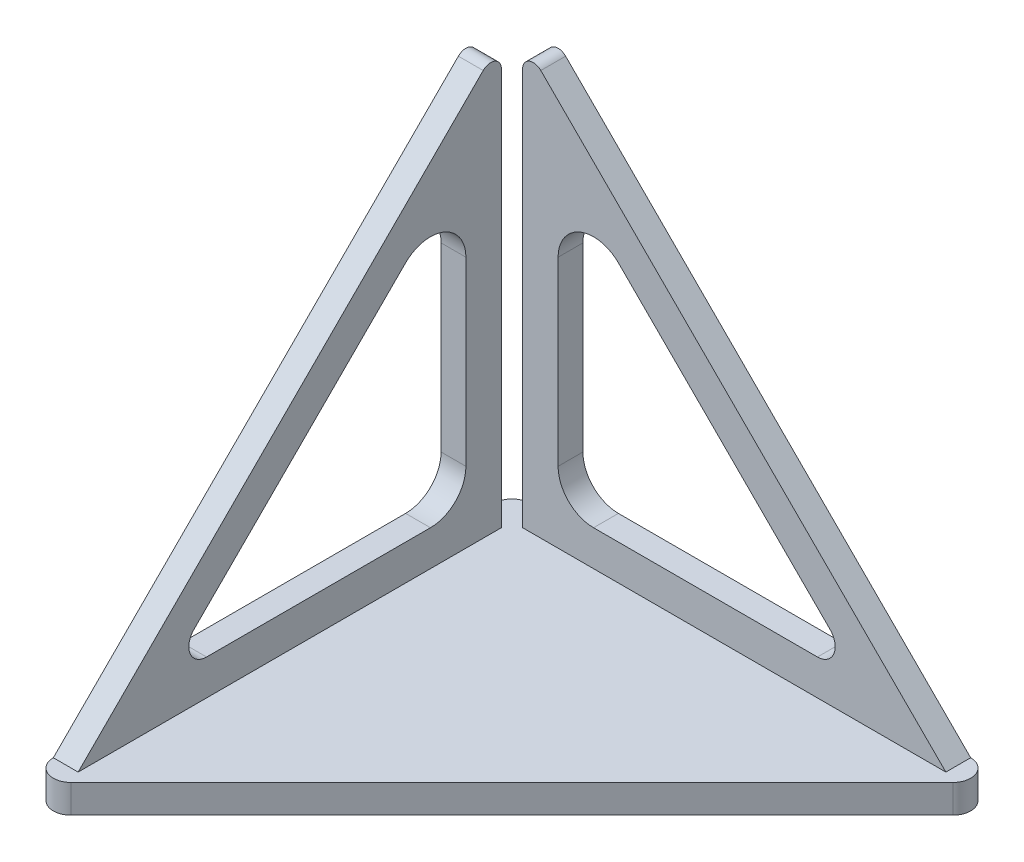
ISO-10303-21;
HEADER;
FILE_DESCRIPTION(('STEP AP214'),'2;1');
FILE_NAME('part.step','',(''),(''),'','','');
FILE_SCHEMA(('AUTOMOTIVE_DESIGN { 1 0 10303 214 1 1 1 1 }'));
ENDSEC;
DATA;
#1=APPLICATION_CONTEXT('core data for automotive mechanical design processes');
#2=APPLICATION_PROTOCOL_DEFINITION('international standard','automotive_design',2000,#1);
#3=PRODUCT_CONTEXT('',#1,'mechanical');
#4=PRODUCT('Part','Part','',(#3));
#5=PRODUCT_RELATED_PRODUCT_CATEGORY('part','',(#4));
#6=PRODUCT_DEFINITION_FORMATION('','',#4);
#7=PRODUCT_DEFINITION_CONTEXT('part definition',#1,'design');
#8=PRODUCT_DEFINITION('design','',#6,#7);
#9=PRODUCT_DEFINITION_SHAPE('','',#8);
#10=(LENGTH_UNIT() NAMED_UNIT(*) SI_UNIT(.MILLI.,.METRE.));
#11=(NAMED_UNIT(*) PLANE_ANGLE_UNIT() SI_UNIT($,.RADIAN.));
#12=(NAMED_UNIT(*) SI_UNIT($,.STERADIAN.) SOLID_ANGLE_UNIT());
#13=UNCERTAINTY_MEASURE_WITH_UNIT(LENGTH_MEASURE(1.E-05),#10,'distance_accuracy_value','');
#14=(GEOMETRIC_REPRESENTATION_CONTEXT(3) GLOBAL_UNCERTAINTY_ASSIGNED_CONTEXT((#13)) GLOBAL_UNIT_ASSIGNED_CONTEXT((#10,
#11,#12)) REPRESENTATION_CONTEXT('',''));
#15=CARTESIAN_POINT('',(0.,0.,0.));
#16=DIRECTION('',(0.,0.,1.));
#17=DIRECTION('',(1.,0.,0.));
#18=AXIS2_PLACEMENT_3D('',#15,#16,#17);
#19=CARTESIAN_POINT('',(5.,0.,5.));
#20=DIRECTION('',(0.,1.,0.));
#21=DIRECTION('',(0.,0.,1.));
#22=AXIS2_PLACEMENT_3D('',#19,#20,#21);
#23=PLANE('',#22);
#24=DIRECTION('',(0.,0.,1.));
#25=VECTOR('',#24,1.);
#26=CARTESIAN_POINT('',(0.,0.,5.00000000000004));
#27=LINE('',#26,#25);
#28=CARTESIAN_POINT('',(0.,0.,5.00000000000004));
#29=VERTEX_POINT('',#28);
#30=CARTESIAN_POINT('',(0.,0.,10.));
#31=VERTEX_POINT('',#30);
#32=EDGE_CURVE('E328',#29,#31,#27,.T.);
#33=ORIENTED_EDGE('',*,*,#32,.T.);
#34=DIRECTION('',(-1.,0.,0.));
#35=VECTOR('',#34,1.);
#36=CARTESIAN_POINT('',(7.,0.,10.));
#37=LINE('',#36,#35);
#38=CARTESIAN_POINT('',(7.,0.,10.));
#39=VERTEX_POINT('',#38);
#40=EDGE_CURVE('E259',#39,#31,#37,.T.);
#41=ORIENTED_EDGE('',*,*,#40,.F.);
#42=DIRECTION('',(0.,0.,-1.));
#43=VECTOR('',#42,1.);
#44=CARTESIAN_POINT('',(7.,0.,129.350288425444));
#45=LINE('',#44,#43);
#46=CARTESIAN_POINT('',(7.,0.,129.350288425444));
#47=VERTEX_POINT('',#46);
#48=EDGE_CURVE('E244',#47,#39,#45,.T.);
#49=ORIENTED_EDGE('',*,*,#48,.F.);
#50=DIRECTION('',(-1.,0.,0.));
#51=VECTOR('',#50,1.);
#52=CARTESIAN_POINT('',(7.,0.,129.350288425444));
#53=LINE('',#52,#51);
#54=CARTESIAN_POINT('',(0.,0.,129.350288425444));
#55=VERTEX_POINT('',#54);
#56=EDGE_CURVE('E252',#47,#55,#53,.T.);
#57=ORIENTED_EDGE('',*,*,#56,.T.);
#58=CARTESIAN_POINT('',(5.,0.,129.350288425444));
#59=DIRECTION('',(0.,1.,0.));
#60=DIRECTION('',(0.,0.,-1.));
#61=AXIS2_PLACEMENT_3D('',#58,#59,#60);
#62=CIRCLE('',#61,4.99999999999999);
#63=CARTESIAN_POINT('',(8.53553390593273,0.,132.885822331377));
#64=VERTEX_POINT('',#63);
#65=EDGE_CURVE('E330',#55,#64,#62,.T.);
#66=ORIENTED_EDGE('',*,*,#65,.T.);
#67=DIRECTION('',(0.707106781186547,0.,-0.707106781186548));
#68=VECTOR('',#67,1.);
#69=CARTESIAN_POINT('',(8.53553390593273,0.,132.885822331377));
#70=LINE('',#69,#68);
#71=CARTESIAN_POINT('',(132.885822331377,0.,8.53553390593272));
#72=VERTEX_POINT('',#71);
#73=EDGE_CURVE('E332',#64,#72,#70,.T.);
#74=ORIENTED_EDGE('',*,*,#73,.T.);
#75=CARTESIAN_POINT('',(129.350288425444,0.,5.));
#76=DIRECTION('',(0.,1.,0.));
#77=DIRECTION('',(0.,0.,1.));
#78=AXIS2_PLACEMENT_3D('',#75,#76,#77);
#79=CIRCLE('',#78,4.99999999999997);
#80=CARTESIAN_POINT('',(129.350288425444,0.,0.));
#81=VERTEX_POINT('',#80);
#82=EDGE_CURVE('E335',#72,#81,#79,.T.);
#83=ORIENTED_EDGE('',*,*,#82,.T.);
#84=DIRECTION('',(0.,0.,-1.));
#85=VECTOR('',#84,1.);
#86=CARTESIAN_POINT('',(129.350288425444,0.,7.));
#87=LINE('',#86,#85);
#88=CARTESIAN_POINT('',(129.350288425444,0.,7.));
#89=VERTEX_POINT('',#88);
#90=EDGE_CURVE('E300',#89,#81,#87,.T.);
#91=ORIENTED_EDGE('',*,*,#90,.F.);
#92=DIRECTION('',(-1.,0.,0.));
#93=VECTOR('',#92,1.);
#94=CARTESIAN_POINT('',(129.350288425444,0.,7.));
#95=LINE('',#94,#93);
#96=CARTESIAN_POINT('',(10.,0.,7.));
#97=VERTEX_POINT('',#96);
#98=EDGE_CURVE('E287',#89,#97,#95,.T.);
#99=ORIENTED_EDGE('',*,*,#98,.T.);
#100=DIRECTION('',(0.,0.,-1.));
#101=VECTOR('',#100,1.);
#102=CARTESIAN_POINT('',(10.,0.,7.));
#103=LINE('',#102,#101);
#104=CARTESIAN_POINT('',(10.,0.,0.));
#105=VERTEX_POINT('',#104);
#106=EDGE_CURVE('E296',#97,#105,#103,.T.);
#107=ORIENTED_EDGE('',*,*,#106,.T.);
#108=DIRECTION('',(-1.,0.,0.));
#109=VECTOR('',#108,1.);
#110=CARTESIAN_POINT('',(129.350288425444,0.,0.));
#111=LINE('',#110,#109);
#112=CARTESIAN_POINT('',(5.00000000000004,0.,0.));
#113=VERTEX_POINT('',#112);
#114=EDGE_CURVE('E310',#105,#113,#111,.T.);
#115=ORIENTED_EDGE('',*,*,#114,.T.);
#116=CARTESIAN_POINT('',(5.,0.,5.));
#117=DIRECTION('',(0.,1.,0.));
#118=DIRECTION('',(0.,0.,1.));
#119=AXIS2_PLACEMENT_3D('',#116,#117,#118);
#120=CIRCLE('',#119,5.);
#121=EDGE_CURVE('E303',#113,#29,#120,.T.);
#122=ORIENTED_EDGE('',*,*,#121,.T.);
#123=EDGE_LOOP('',(#33,#41,#49,#57,#66,#74,#83,#91,#99,#107,#115,#122));
#124=FACE_BOUND('',#123,.T.);
#125=ADVANCED_FACE('F73',(#124),#23,.T.);
#126=CARTESIAN_POINT('',(5.,-8.,5.));
#127=DIRECTION('',(0.,1.,0.));
#128=DIRECTION('',(0.,0.,1.));
#129=AXIS2_PLACEMENT_3D('',#126,#127,#128);
#130=CYLINDRICAL_SURFACE('',#129,5.);
#131=ORIENTED_EDGE('',*,*,#121,.F.);
#132=DIRECTION('',(0.,1.,0.));
#133=VECTOR('',#132,1.);
#134=CARTESIAN_POINT('',(5.00000000000004,-8.,0.));
#135=LINE('',#134,#133);
#136=CARTESIAN_POINT('',(5.00000000000004,-8.,0.));
#137=VERTEX_POINT('',#136);
#138=EDGE_CURVE('E339',#137,#113,#135,.T.);
#139=ORIENTED_EDGE('',*,*,#138,.F.);
#140=CARTESIAN_POINT('',(5.,-8.,5.));
#141=DIRECTION('',(0.,1.,0.));
#142=DIRECTION('',(0.,0.,1.));
#143=AXIS2_PLACEMENT_3D('',#140,#141,#142);
#144=CIRCLE('',#143,5.);
#145=CARTESIAN_POINT('',(0.,-8.,5.00000000000004));
#146=VERTEX_POINT('',#145);
#147=EDGE_CURVE('E306',#137,#146,#144,.T.);
#148=ORIENTED_EDGE('',*,*,#147,.T.);
#149=DIRECTION('',(0.,1.,0.));
#150=VECTOR('',#149,1.);
#151=CARTESIAN_POINT('',(0.,-8.,5.00000000000004));
#152=LINE('',#151,#150);
#153=EDGE_CURVE('E325',#146,#29,#152,.T.);
#154=ORIENTED_EDGE('',*,*,#153,.T.);
#155=EDGE_LOOP('',(#131,#139,#148,#154));
#156=FACE_BOUND('',#155,.T.);
#157=ADVANCED_FACE('F467',(#156),#130,.T.);
#158=CARTESIAN_POINT('',(129.350288425444,-8.,0.));
#159=DIRECTION('',(0.,0.,-1.));
#160=DIRECTION('',(-1.,0.,0.));
#161=AXIS2_PLACEMENT_3D('',#158,#159,#160);
#162=PLANE('',#161);
#163=DIRECTION('',(0.,1.,0.));
#164=VECTOR('',#163,1.);
#165=CARTESIAN_POINT('',(10.,0.,0.));
#166=LINE('',#165,#164);
#167=CARTESIAN_POINT('',(10.,112.107647738324,0.));
#168=VERTEX_POINT('',#167);
#169=EDGE_CURVE('E280',#105,#168,#166,.T.);
#170=ORIENTED_EDGE('',*,*,#169,.T.);
#171=CARTESIAN_POINT('',(13.,112.107647738324,0.));
#172=DIRECTION('',(0.,0.,-1.));
#173=DIRECTION('',(-1.,0.,0.));
#174=AXIS2_PLACEMENT_3D('',#171,#172,#173);
#175=CIRCLE('',#174,3.);
#176=CARTESIAN_POINT('',(15.1213203435597,114.228968081883,0.));
#177=VERTEX_POINT('',#176);
#178=EDGE_CURVE('E412',#168,#177,#175,.T.);
#179=ORIENTED_EDGE('',*,*,#178,.T.);
#180=DIRECTION('',(0.707106781186551,-0.707106781186544,0.));
#181=VECTOR('',#180,1.);
#182=CARTESIAN_POINT('',(10.,119.350288425443,0.));
#183=LINE('',#182,#181);
#184=EDGE_CURVE('E291',#177,#81,#183,.T.);
#185=ORIENTED_EDGE('',*,*,#184,.T.);
#186=DIRECTION('',(0.,1.,0.));
#187=VECTOR('',#186,1.);
#188=CARTESIAN_POINT('',(129.350288425444,-8.,0.));
#189=LINE('',#188,#187);
#190=CARTESIAN_POINT('',(129.350288425444,-8.,0.));
#191=VERTEX_POINT('',#190);
#192=EDGE_CURVE('E343',#191,#81,#189,.T.);
#193=ORIENTED_EDGE('',*,*,#192,.F.);
#194=DIRECTION('',(-1.,0.,0.));
#195=VECTOR('',#194,1.);
#196=CARTESIAN_POINT('',(129.350288425444,-8.,0.));
#197=LINE('',#196,#195);
#198=EDGE_CURVE('E322',#191,#137,#197,.T.);
#199=ORIENTED_EDGE('',*,*,#198,.T.);
#200=ORIENTED_EDGE('',*,*,#138,.T.);
#201=ORIENTED_EDGE('',*,*,#114,.F.);
#202=EDGE_LOOP('',(#170,#179,#185,#193,#199,#200,#201));
#203=FACE_BOUND('',#202,.T.);
#204=DIRECTION('',(-1.,0.,0.));
#205=VECTOR('',#204,1.);
#206=CARTESIAN_POINT('',(129.350288425444,10.,0.));
#207=LINE('',#206,#205);
#208=CARTESIAN_POINT('',(93.1370849898474,10.,0.));
#209=VERTEX_POINT('',#208);
#210=CARTESIAN_POINT('',(30.,10.,0.));
#211=VERTEX_POINT('',#210);
#212=EDGE_CURVE('E258',#209,#211,#207,.T.);
#213=ORIENTED_EDGE('',*,*,#212,.F.);
#214=CARTESIAN_POINT('',(93.1370849898474,15.,0.));
#215=DIRECTION('',(0.,0.,-1.));
#216=DIRECTION('',(-1.,0.,0.));
#217=AXIS2_PLACEMENT_3D('',#214,#215,#216);
#218=CIRCLE('',#217,5.);
#219=CARTESIAN_POINT('',(96.6726188957801,18.5355339059327,0.));
#220=VERTEX_POINT('',#219);
#221=EDGE_CURVE('E405',#209,#220,#218,.F.);
#222=ORIENTED_EDGE('',*,*,#221,.T.);
#223=DIRECTION('',(0.707106781186551,-0.707106781186544,0.));
#224=VECTOR('',#223,1.);
#225=CARTESIAN_POINT('',(2.9289321881346,112.279220613577,0.));
#226=LINE('',#225,#224);
#227=CARTESIAN_POINT('',(37.0710678118655,78.1370849898467,0.));
#228=VERTEX_POINT('',#227);
#229=EDGE_CURVE('E274',#228,#220,#226,.T.);
#230=ORIENTED_EDGE('',*,*,#229,.F.);
#231=CARTESIAN_POINT('',(30.,71.0660171779812,0.));
#232=DIRECTION('',(0.,0.,-1.));
#233=DIRECTION('',(-1.,0.,0.));
#234=AXIS2_PLACEMENT_3D('',#231,#232,#233);
#235=CIRCLE('',#234,10.);
#236=CARTESIAN_POINT('',(20.,71.0660171779812,0.));
#237=VERTEX_POINT('',#236);
#238=EDGE_CURVE('E382',#228,#237,#235,.F.);
#239=ORIENTED_EDGE('',*,*,#238,.T.);
#240=DIRECTION('',(0.,1.,0.));
#241=VECTOR('',#240,1.);
#242=CARTESIAN_POINT('',(20.,0.,0.));
#243=LINE('',#242,#241);
#244=CARTESIAN_POINT('',(20.,20.,0.));
#245=VERTEX_POINT('',#244);
#246=EDGE_CURVE('E282',#245,#237,#243,.T.);
#247=ORIENTED_EDGE('',*,*,#246,.F.);
#248=CARTESIAN_POINT('',(30.,20.,0.));
#249=DIRECTION('',(0.,0.,-1.));
#250=DIRECTION('',(-1.,0.,0.));
#251=AXIS2_PLACEMENT_3D('',#248,#249,#250);
#252=CIRCLE('',#251,10.);
#253=EDGE_CURVE('E386',#245,#211,#252,.F.);
#254=ORIENTED_EDGE('',*,*,#253,.T.);
#255=EDGE_LOOP('',(#213,#222,#230,#239,#247,#254));
#256=FACE_BOUND('',#255,.T.);
#257=ADVANCED_FACE('F439',(#203,#256),#162,.T.);
#258=CARTESIAN_POINT('',(129.350288425444,-8.,5.));
#259=DIRECTION('',(0.,1.,0.));
#260=DIRECTION('',(0.,0.,1.));
#261=AXIS2_PLACEMENT_3D('',#258,#259,#260);
#262=CYLINDRICAL_SURFACE('',#261,4.99999999999997);
#263=ORIENTED_EDGE('',*,*,#82,.F.);
#264=DIRECTION('',(0.,1.,0.));
#265=VECTOR('',#264,1.);
#266=CARTESIAN_POINT('',(132.885822331377,-8.,8.53553390593272));
#267=LINE('',#266,#265);
#268=CARTESIAN_POINT('',(132.885822331377,-8.,8.53553390593272));
#269=VERTEX_POINT('',#268);
#270=EDGE_CURVE('E346',#269,#72,#267,.T.);
#271=ORIENTED_EDGE('',*,*,#270,.F.);
#272=CARTESIAN_POINT('',(129.350288425444,-8.,5.));
#273=DIRECTION('',(0.,1.,0.));
#274=DIRECTION('',(0.,0.,1.));
#275=AXIS2_PLACEMENT_3D('',#272,#273,#274);
#276=CIRCLE('',#275,4.99999999999997);
#277=EDGE_CURVE('E319',#269,#191,#276,.T.);
#278=ORIENTED_EDGE('',*,*,#277,.T.);
#279=ORIENTED_EDGE('',*,*,#192,.T.);
#280=EDGE_LOOP('',(#263,#271,#278,#279));
#281=FACE_BOUND('',#280,.T.);
#282=ADVANCED_FACE('F436',(#281),#262,.T.);
#283=CARTESIAN_POINT('',(8.53553390593273,-8.,132.885822331377));
#284=DIRECTION('',(0.707106781186548,0.,0.707106781186547));
#285=DIRECTION('',(0.707106781186547,0.,-0.707106781186548));
#286=AXIS2_PLACEMENT_3D('',#283,#284,#285);
#287=PLANE('',#286);
#288=ORIENTED_EDGE('',*,*,#73,.F.);
#289=DIRECTION('',(0.,1.,0.));
#290=VECTOR('',#289,1.);
#291=CARTESIAN_POINT('',(8.53553390593273,-8.,132.885822331377));
#292=LINE('',#291,#290);
#293=CARTESIAN_POINT('',(8.53553390593273,-8.,132.885822331377));
#294=VERTEX_POINT('',#293);
#295=EDGE_CURVE('E348',#294,#64,#292,.T.);
#296=ORIENTED_EDGE('',*,*,#295,.F.);
#297=DIRECTION('',(0.707106781186547,0.,-0.707106781186548));
#298=VECTOR('',#297,1.);
#299=CARTESIAN_POINT('',(8.53553390593273,-8.,132.885822331377));
#300=LINE('',#299,#298);
#301=EDGE_CURVE('E316',#294,#269,#300,.T.);
#302=ORIENTED_EDGE('',*,*,#301,.T.);
#303=ORIENTED_EDGE('',*,*,#270,.T.);
#304=EDGE_LOOP('',(#288,#296,#302,#303));
#305=FACE_BOUND('',#304,.T.);
#306=ADVANCED_FACE('F432',(#305),#287,.T.);
#307=CARTESIAN_POINT('',(5.,-8.,129.350288425444));
#308=DIRECTION('',(0.,1.,0.));
#309=DIRECTION('',(0.,0.,1.));
#310=AXIS2_PLACEMENT_3D('',#307,#308,#309);
#311=CYLINDRICAL_SURFACE('',#310,4.99999999999999);
#312=ORIENTED_EDGE('',*,*,#65,.F.);
#313=DIRECTION('',(0.,1.,0.));
#314=VECTOR('',#313,1.);
#315=CARTESIAN_POINT('',(0.,-8.,129.350288425444));
#316=LINE('',#315,#314);
#317=CARTESIAN_POINT('',(0.,-8.,129.350288425444));
#318=VERTEX_POINT('',#317);
#319=EDGE_CURVE('E350',#318,#55,#316,.T.);
#320=ORIENTED_EDGE('',*,*,#319,.F.);
#321=CARTESIAN_POINT('',(5.,-8.,129.350288425444));
#322=DIRECTION('',(0.,1.,0.));
#323=DIRECTION('',(0.,0.,-1.));
#324=AXIS2_PLACEMENT_3D('',#321,#322,#323);
#325=CIRCLE('',#324,4.99999999999999);
#326=EDGE_CURVE('E313',#318,#294,#325,.T.);
#327=ORIENTED_EDGE('',*,*,#326,.T.);
#328=ORIENTED_EDGE('',*,*,#295,.T.);
#329=EDGE_LOOP('',(#312,#320,#327,#328));
#330=FACE_BOUND('',#329,.T.);
#331=ADVANCED_FACE('F427',(#330),#311,.T.);
#332=CARTESIAN_POINT('',(0.,-8.,5.00000000000004));
#333=DIRECTION('',(-1.,0.,0.));
#334=DIRECTION('',(0.,0.,1.));
#335=AXIS2_PLACEMENT_3D('',#332,#333,#334);
#336=PLANE('',#335);
#337=DIRECTION('',(0.,-0.707106781186544,0.707106781186552));
#338=VECTOR('',#337,1.);
#339=CARTESIAN_POINT('',(0.,119.350288425443,10.));
#340=LINE('',#339,#338);
#341=CARTESIAN_POINT('',(0.,114.228968081883,15.1213203435597));
#342=VERTEX_POINT('',#341);
#343=EDGE_CURVE('E254',#342,#55,#340,.T.);
#344=ORIENTED_EDGE('',*,*,#343,.F.);
#345=CARTESIAN_POINT('',(0.,112.107647738323,13.));
#346=DIRECTION('',(-1.,0.,0.));
#347=DIRECTION('',(0.,0.,1.));
#348=AXIS2_PLACEMENT_3D('',#345,#346,#347);
#349=CIRCLE('',#348,3.);
#350=CARTESIAN_POINT('',(0.,112.107647738323,10.));
#351=VERTEX_POINT('',#350);
#352=EDGE_CURVE('E95',#342,#351,#349,.T.);
#353=ORIENTED_EDGE('',*,*,#352,.T.);
#354=DIRECTION('',(0.,1.,0.));
#355=VECTOR('',#354,1.);
#356=CARTESIAN_POINT('',(0.,0.,10.));
#357=LINE('',#356,#355);
#358=EDGE_CURVE('E267',#31,#351,#357,.T.);
#359=ORIENTED_EDGE('',*,*,#358,.F.);
#360=ORIENTED_EDGE('',*,*,#32,.F.);
#361=ORIENTED_EDGE('',*,*,#153,.F.);
#362=DIRECTION('',(0.,0.,1.));
#363=VECTOR('',#362,1.);
#364=CARTESIAN_POINT('',(0.,-8.,5.00000000000004));
#365=LINE('',#364,#363);
#366=EDGE_CURVE('E309',#146,#318,#365,.T.);
#367=ORIENTED_EDGE('',*,*,#366,.T.);
#368=ORIENTED_EDGE('',*,*,#319,.T.);
#369=EDGE_LOOP('',(#344,#353,#359,#360,#361,#367,#368));
#370=FACE_BOUND('',#369,.T.);
#371=DIRECTION('',(0.,-0.707106781186544,0.707106781186551));
#372=VECTOR('',#371,1.);
#373=CARTESIAN_POINT('',(0.,112.279220613577,2.9289321881346));
#374=LINE('',#373,#372);
#375=CARTESIAN_POINT('',(0.,78.1370849898467,37.0710678118655));
#376=VERTEX_POINT('',#375);
#377=CARTESIAN_POINT('',(0.,18.5355339059328,96.67261889578));
#378=VERTEX_POINT('',#377);
#379=EDGE_CURVE('E533',#376,#378,#374,.T.);
#380=ORIENTED_EDGE('',*,*,#379,.T.);
#381=CARTESIAN_POINT('',(0.,15.,93.1370849898473));
#382=DIRECTION('',(-1.,0.,0.));
#383=DIRECTION('',(0.,0.,1.));
#384=AXIS2_PLACEMENT_3D('',#381,#382,#383);
#385=CIRCLE('',#384,5.);
#386=CARTESIAN_POINT('',(0.,9.99999999999999,93.1370849898473));
#387=VERTEX_POINT('',#386);
#388=EDGE_CURVE('E401',#378,#387,#385,.F.);
#389=ORIENTED_EDGE('',*,*,#388,.T.);
#390=DIRECTION('',(0.,0.,-1.));
#391=VECTOR('',#390,1.);
#392=CARTESIAN_POINT('',(0.,10.,129.350288425444));
#393=LINE('',#392,#391);
#394=CARTESIAN_POINT('',(0.,9.99999999999999,30.));
#395=VERTEX_POINT('',#394);
#396=EDGE_CURVE('E527',#387,#395,#393,.T.);
#397=ORIENTED_EDGE('',*,*,#396,.T.);
#398=CARTESIAN_POINT('',(0.,20.,30.));
#399=DIRECTION('',(-1.,0.,0.));
#400=DIRECTION('',(0.,0.,1.));
#401=AXIS2_PLACEMENT_3D('',#398,#399,#400);
#402=CIRCLE('',#401,10.);
#403=CARTESIAN_POINT('',(0.,20.,20.));
#404=VERTEX_POINT('',#403);
#405=EDGE_CURVE('E377',#395,#404,#402,.F.);
#406=ORIENTED_EDGE('',*,*,#405,.T.);
#407=DIRECTION('',(0.,1.,0.));
#408=VECTOR('',#407,1.);
#409=CARTESIAN_POINT('',(0.,0.,20.));
#410=LINE('',#409,#408);
#411=CARTESIAN_POINT('',(0.,71.0660171779811,20.));
#412=VERTEX_POINT('',#411);
#413=EDGE_CURVE('E530',#404,#412,#410,.T.);
#414=ORIENTED_EDGE('',*,*,#413,.T.);
#415=CARTESIAN_POINT('',(0.,71.0660171779811,30.));
#416=DIRECTION('',(-1.,0.,0.));
#417=DIRECTION('',(0.,0.,1.));
#418=AXIS2_PLACEMENT_3D('',#415,#416,#417);
#419=CIRCLE('',#418,10.);
#420=EDGE_CURVE('E373',#412,#376,#419,.F.);
#421=ORIENTED_EDGE('',*,*,#420,.T.);
#422=EDGE_LOOP('',(#380,#389,#397,#406,#414,#421));
#423=FACE_BOUND('',#422,.T.);
#424=ADVANCED_FACE('F421',(#370,#423),#336,.T.);
#425=CARTESIAN_POINT('',(5.,-8.,5.));
#426=DIRECTION('',(0.,1.,0.));
#427=DIRECTION('',(0.,0.,1.));
#428=AXIS2_PLACEMENT_3D('',#425,#426,#427);
#429=PLANE('',#428);
#430=ORIENTED_EDGE('',*,*,#147,.F.);
#431=ORIENTED_EDGE('',*,*,#198,.F.);
#432=ORIENTED_EDGE('',*,*,#277,.F.);
#433=ORIENTED_EDGE('',*,*,#301,.F.);
#434=ORIENTED_EDGE('',*,*,#326,.F.);
#435=ORIENTED_EDGE('',*,*,#366,.F.);
#436=EDGE_LOOP('',(#430,#431,#432,#433,#434,#435));
#437=FACE_BOUND('',#436,.T.);
#438=ADVANCED_FACE('F476',(#437),#429,.F.);
#439=CARTESIAN_POINT('',(10.,119.350288425443,7.));
#440=DIRECTION('',(0.707106781186544,0.707106781186551,0.));
#441=DIRECTION('',(-0.707106781186551,0.707106781186544,0.));
#442=AXIS2_PLACEMENT_3D('',#439,#440,#441);
#443=PLANE('',#442);
#444=ORIENTED_EDGE('',*,*,#184,.F.);
#445=DIRECTION('',(0.,0.,-1.));
#446=VECTOR('',#445,1.);
#447=CARTESIAN_POINT('',(15.1213203435597,114.228968081883,7.));
#448=LINE('',#447,#446);
#449=CARTESIAN_POINT('',(15.1213203435597,114.228968081883,7.));
#450=VERTEX_POINT('',#449);
#451=EDGE_CURVE('E414',#177,#450,#448,.F.);
#452=ORIENTED_EDGE('',*,*,#451,.T.);
#453=DIRECTION('',(0.707106781186551,-0.707106781186544,0.));
#454=VECTOR('',#453,1.);
#455=CARTESIAN_POINT('',(10.,119.350288425443,7.));
#456=LINE('',#455,#454);
#457=EDGE_CURVE('E294',#450,#89,#456,.T.);
#458=ORIENTED_EDGE('',*,*,#457,.T.);
#459=ORIENTED_EDGE('',*,*,#90,.T.);
#460=EDGE_LOOP('',(#444,#452,#458,#459));
#461=FACE_BOUND('',#460,.T.);
#462=ADVANCED_FACE('F444',(#461),#443,.T.);
#463=CARTESIAN_POINT('',(10.,0.,7.));
#464=DIRECTION('',(-1.,0.,0.));
#465=DIRECTION('',(0.,0.,1.));
#466=AXIS2_PLACEMENT_3D('',#463,#464,#465);
#467=PLANE('',#466);
#468=DIRECTION('',(0.,1.,0.));
#469=VECTOR('',#468,1.);
#470=CARTESIAN_POINT('',(10.,0.,7.));
#471=LINE('',#470,#469);
#472=CARTESIAN_POINT('',(10.,112.107647738324,7.));
#473=VERTEX_POINT('',#472);
#474=EDGE_CURVE('E290',#97,#473,#471,.T.);
#475=ORIENTED_EDGE('',*,*,#474,.T.);
#476=DIRECTION('',(0.,0.,-1.));
#477=VECTOR('',#476,1.);
#478=CARTESIAN_POINT('',(10.,112.107647738324,7.));
#479=LINE('',#478,#477);
#480=EDGE_CURVE('E409',#473,#168,#479,.T.);
#481=ORIENTED_EDGE('',*,*,#480,.T.);
#482=ORIENTED_EDGE('',*,*,#169,.F.);
#483=ORIENTED_EDGE('',*,*,#106,.F.);
#484=EDGE_LOOP('',(#475,#481,#482,#483));
#485=FACE_BOUND('',#484,.T.);
#486=ADVANCED_FACE('F454',(#485),#467,.T.);
#487=CARTESIAN_POINT('',(0.,0.,7.));
#488=DIRECTION('',(0.,0.,-1.));
#489=DIRECTION('',(-1.,0.,0.));
#490=AXIS2_PLACEMENT_3D('',#487,#488,#489);
#491=PLANE('',#490);
#492=DIRECTION('',(0.,1.,0.));
#493=VECTOR('',#492,1.);
#494=CARTESIAN_POINT('',(20.,0.,7.));
#495=LINE('',#494,#493);
#496=CARTESIAN_POINT('',(20.,20.,7.));
#497=VERTEX_POINT('',#496);
#498=CARTESIAN_POINT('',(20.,71.0660171779812,7.));
#499=VERTEX_POINT('',#498);
#500=EDGE_CURVE('E273',#497,#499,#495,.T.);
#501=ORIENTED_EDGE('',*,*,#500,.T.);
#502=CARTESIAN_POINT('',(30.,71.0660171779812,7.));
#503=DIRECTION('',(0.,0.,-1.));
#504=DIRECTION('',(-1.,0.,0.));
#505=AXIS2_PLACEMENT_3D('',#502,#503,#504);
#506=CIRCLE('',#505,10.);
#507=CARTESIAN_POINT('',(37.0710678118655,78.1370849898467,7.));
#508=VERTEX_POINT('',#507);
#509=EDGE_CURVE('E384',#499,#508,#506,.T.);
#510=ORIENTED_EDGE('',*,*,#509,.T.);
#511=DIRECTION('',(0.707106781186551,-0.707106781186544,0.));
#512=VECTOR('',#511,1.);
#513=CARTESIAN_POINT('',(2.9289321881346,112.279220613577,7.));
#514=LINE('',#513,#512);
#515=CARTESIAN_POINT('',(96.6726188957801,18.5355339059327,7.));
#516=VERTEX_POINT('',#515);
#517=EDGE_CURVE('E277',#508,#516,#514,.T.);
#518=ORIENTED_EDGE('',*,*,#517,.T.);
#519=CARTESIAN_POINT('',(93.1370849898474,15.,7.));
#520=DIRECTION('',(0.,0.,-1.));
#521=DIRECTION('',(-1.,0.,0.));
#522=AXIS2_PLACEMENT_3D('',#519,#520,#521);
#523=CIRCLE('',#522,5.);
#524=CARTESIAN_POINT('',(93.1370849898474,10.,7.));
#525=VERTEX_POINT('',#524);
#526=EDGE_CURVE('E407',#516,#525,#523,.T.);
#527=ORIENTED_EDGE('',*,*,#526,.T.);
#528=DIRECTION('',(-1.,0.,0.));
#529=VECTOR('',#528,1.);
#530=CARTESIAN_POINT('',(129.350288425444,10.,7.));
#531=LINE('',#530,#529);
#532=CARTESIAN_POINT('',(30.,10.,7.));
#533=VERTEX_POINT('',#532);
#534=EDGE_CURVE('E271',#525,#533,#531,.T.);
#535=ORIENTED_EDGE('',*,*,#534,.T.);
#536=CARTESIAN_POINT('',(30.,20.,7.));
#537=DIRECTION('',(0.,0.,-1.));
#538=DIRECTION('',(-1.,0.,0.));
#539=AXIS2_PLACEMENT_3D('',#536,#537,#538);
#540=CIRCLE('',#539,10.);
#541=EDGE_CURVE('E389',#533,#497,#540,.T.);
#542=ORIENTED_EDGE('',*,*,#541,.T.);
#543=EDGE_LOOP('',(#501,#510,#518,#527,#535,#542));
#544=FACE_BOUND('',#543,.T.);
#545=ORIENTED_EDGE('',*,*,#457,.F.);
#546=CARTESIAN_POINT('',(13.,112.107647738324,7.));
#547=DIRECTION('',(0.,0.,-1.));
#548=DIRECTION('',(-1.,0.,0.));
#549=AXIS2_PLACEMENT_3D('',#546,#547,#548);
#550=CIRCLE('',#549,3.);
#551=EDGE_CURVE('E416',#450,#473,#550,.F.);
#552=ORIENTED_EDGE('',*,*,#551,.T.);
#553=ORIENTED_EDGE('',*,*,#474,.F.);
#554=ORIENTED_EDGE('',*,*,#98,.F.);
#555=EDGE_LOOP('',(#545,#552,#553,#554));
#556=FACE_BOUND('',#555,.T.);
#557=ADVANCED_FACE('F450',(#544,#556),#491,.F.);
#558=CARTESIAN_POINT('',(129.350288425444,10.,7.));
#559=DIRECTION('',(0.,-1.,0.));
#560=DIRECTION('',(0.,0.,-1.));
#561=AXIS2_PLACEMENT_3D('',#558,#559,#560);
#562=PLANE('',#561);
#563=ORIENTED_EDGE('',*,*,#534,.F.);
#564=DIRECTION('',(0.,0.,-1.));
#565=VECTOR('',#564,1.);
#566=CARTESIAN_POINT('',(93.1370849898474,10.,0.));
#567=LINE('',#566,#565);
#568=EDGE_CURVE('E396',#525,#209,#567,.T.);
#569=ORIENTED_EDGE('',*,*,#568,.T.);
#570=ORIENTED_EDGE('',*,*,#212,.T.);
#571=DIRECTION('',(0.,0.,-1.));
#572=VECTOR('',#571,1.);
#573=CARTESIAN_POINT('',(30.,10.,7.));
#574=LINE('',#573,#572);
#575=EDGE_CURVE('E370',#211,#533,#574,.F.);
#576=ORIENTED_EDGE('',*,*,#575,.T.);
#577=EDGE_LOOP('',(#563,#569,#570,#576));
#578=FACE_BOUND('',#577,.T.);
#579=ADVANCED_FACE('F551',(#578),#562,.F.);
#580=CARTESIAN_POINT('',(2.9289321881346,112.279220613577,7.));
#581=DIRECTION('',(0.707106781186544,0.707106781186551,0.));
#582=DIRECTION('',(-0.707106781186551,0.707106781186544,0.));
#583=AXIS2_PLACEMENT_3D('',#580,#581,#582);
#584=PLANE('',#583);
#585=ORIENTED_EDGE('',*,*,#229,.T.);
#586=DIRECTION('',(0.,0.,-1.));
#587=VECTOR('',#586,1.);
#588=CARTESIAN_POINT('',(96.6726188957801,18.5355339059328,7.));
#589=LINE('',#588,#587);
#590=EDGE_CURVE('E399',#220,#516,#589,.F.);
#591=ORIENTED_EDGE('',*,*,#590,.T.);
#592=ORIENTED_EDGE('',*,*,#517,.F.);
#593=DIRECTION('',(0.,0.,-1.));
#594=VECTOR('',#593,1.);
#595=CARTESIAN_POINT('',(37.0710678118655,78.1370849898467,0.));
#596=LINE('',#595,#594);
#597=EDGE_CURVE('E362',#508,#228,#596,.T.);
#598=ORIENTED_EDGE('',*,*,#597,.T.);
#599=EDGE_LOOP('',(#585,#591,#592,#598));
#600=FACE_BOUND('',#599,.T.);
#601=ADVANCED_FACE('F555',(#600),#584,.F.);
#602=CARTESIAN_POINT('',(20.,0.,7.));
#603=DIRECTION('',(-1.,0.,0.));
#604=DIRECTION('',(0.,0.,1.));
#605=AXIS2_PLACEMENT_3D('',#602,#603,#604);
#606=PLANE('',#605);
#607=ORIENTED_EDGE('',*,*,#246,.T.);
#608=DIRECTION('',(0.,0.,-1.));
#609=VECTOR('',#608,1.);
#610=CARTESIAN_POINT('',(20.,71.0660171779812,7.));
#611=LINE('',#610,#609);
#612=EDGE_CURVE('E368',#237,#499,#611,.F.);
#613=ORIENTED_EDGE('',*,*,#612,.T.);
#614=ORIENTED_EDGE('',*,*,#500,.F.);
#615=DIRECTION('',(0.,0.,-1.));
#616=VECTOR('',#615,1.);
#617=CARTESIAN_POINT('',(20.,20.,0.));
#618=LINE('',#617,#616);
#619=EDGE_CURVE('E365',#497,#245,#618,.T.);
#620=ORIENTED_EDGE('',*,*,#619,.T.);
#621=EDGE_LOOP('',(#607,#613,#614,#620));
#622=FACE_BOUND('',#621,.T.);
#623=ADVANCED_FACE('F557',(#622),#606,.F.);
#624=CARTESIAN_POINT('',(7.,0.,0.));
#625=DIRECTION('',(-1.,0.,0.));
#626=DIRECTION('',(0.,0.,1.));
#627=AXIS2_PLACEMENT_3D('',#624,#625,#626);
#628=PLANE('',#627);
#629=DIRECTION('',(0.,1.,0.));
#630=VECTOR('',#629,1.);
#631=CARTESIAN_POINT('',(7.,0.,10.));
#632=LINE('',#631,#630);
#633=CARTESIAN_POINT('',(7.,112.107647738323,10.));
#634=VERTEX_POINT('',#633);
#635=EDGE_CURVE('E249',#39,#634,#632,.T.);
#636=ORIENTED_EDGE('',*,*,#635,.T.);
#637=CARTESIAN_POINT('',(7.,112.107647738323,13.));
#638=DIRECTION('',(-1.,0.,0.));
#639=DIRECTION('',(0.,0.,1.));
#640=AXIS2_PLACEMENT_3D('',#637,#638,#639);
#641=CIRCLE('',#640,3.);
#642=CARTESIAN_POINT('',(7.,114.228968081883,15.1213203435597));
#643=VERTEX_POINT('',#642);
#644=EDGE_CURVE('E12',#634,#643,#641,.F.);
#645=ORIENTED_EDGE('',*,*,#644,.T.);
#646=DIRECTION('',(0.,-0.707106781186544,0.707106781186552));
#647=VECTOR('',#646,1.);
#648=CARTESIAN_POINT('',(7.,119.350288425443,10.));
#649=LINE('',#648,#647);
#650=EDGE_CURVE('E239',#643,#47,#649,.T.);
#651=ORIENTED_EDGE('',*,*,#650,.T.);
#652=ORIENTED_EDGE('',*,*,#48,.T.);
#653=EDGE_LOOP('',(#636,#645,#651,#652));
#654=FACE_BOUND('',#653,.T.);
#655=DIRECTION('',(0.,1.,0.));
#656=VECTOR('',#655,1.);
#657=CARTESIAN_POINT('',(7.,0.,20.));
#658=LINE('',#657,#656);
#659=CARTESIAN_POINT('',(7.,20.,20.));
#660=VERTEX_POINT('',#659);
#661=CARTESIAN_POINT('',(7.,71.0660171779811,20.));
#662=VERTEX_POINT('',#661);
#663=EDGE_CURVE('E523',#660,#662,#658,.T.);
#664=ORIENTED_EDGE('',*,*,#663,.F.);
#665=CARTESIAN_POINT('',(7.,20.,30.));
#666=DIRECTION('',(-1.,0.,0.));
#667=DIRECTION('',(0.,0.,1.));
#668=AXIS2_PLACEMENT_3D('',#665,#666,#667);
#669=CIRCLE('',#668,10.);
#670=CARTESIAN_POINT('',(7.,9.99999999999999,30.));
#671=VERTEX_POINT('',#670);
#672=EDGE_CURVE('E379',#660,#671,#669,.T.);
#673=ORIENTED_EDGE('',*,*,#672,.T.);
#674=DIRECTION('',(0.,0.,-1.));
#675=VECTOR('',#674,1.);
#676=CARTESIAN_POINT('',(7.,10.,129.350288425444));
#677=LINE('',#676,#675);
#678=CARTESIAN_POINT('',(7.,9.99999999999999,93.1370849898473));
#679=VERTEX_POINT('',#678);
#680=EDGE_CURVE('E269',#679,#671,#677,.T.);
#681=ORIENTED_EDGE('',*,*,#680,.F.);
#682=CARTESIAN_POINT('',(7.,15.,93.1370849898473));
#683=DIRECTION('',(-1.,0.,0.));
#684=DIRECTION('',(0.,0.,1.));
#685=AXIS2_PLACEMENT_3D('',#682,#683,#684);
#686=CIRCLE('',#685,5.);
#687=CARTESIAN_POINT('',(7.,18.5355339059328,96.67261889578));
#688=VERTEX_POINT('',#687);
#689=EDGE_CURVE('E403',#679,#688,#686,.T.);
#690=ORIENTED_EDGE('',*,*,#689,.T.);
#691=DIRECTION('',(0.,-0.707106781186544,0.707106781186551));
#692=VECTOR('',#691,1.);
#693=CARTESIAN_POINT('',(7.,112.279220613577,2.9289321881346));
#694=LINE('',#693,#692);
#695=CARTESIAN_POINT('',(7.,78.1370849898467,37.0710678118655));
#696=VERTEX_POINT('',#695);
#697=EDGE_CURVE('E516',#696,#688,#694,.T.);
#698=ORIENTED_EDGE('',*,*,#697,.F.);
#699=CARTESIAN_POINT('',(7.,71.0660171779811,30.));
#700=DIRECTION('',(-1.,0.,0.));
#701=DIRECTION('',(0.,0.,1.));
#702=AXIS2_PLACEMENT_3D('',#699,#700,#701);
#703=CIRCLE('',#702,10.);
#704=EDGE_CURVE('E375',#696,#662,#703,.T.);
#705=ORIENTED_EDGE('',*,*,#704,.T.);
#706=EDGE_LOOP('',(#664,#673,#681,#690,#698,#705));
#707=FACE_BOUND('',#706,.T.);
#708=ADVANCED_FACE('F241',(#654,#707),#628,.F.);
#709=CARTESIAN_POINT('',(7.,0.,10.));
#710=DIRECTION('',(0.,0.,1.));
#711=DIRECTION('',(1.,0.,0.));
#712=AXIS2_PLACEMENT_3D('',#709,#710,#711);
#713=PLANE('',#712);
#714=ORIENTED_EDGE('',*,*,#358,.T.);
#715=DIRECTION('',(-1.,0.,0.));
#716=VECTOR('',#715,1.);
#717=CARTESIAN_POINT('',(7.,112.107647738323,10.));
#718=LINE('',#717,#716);
#719=EDGE_CURVE('E81',#351,#634,#718,.F.);
#720=ORIENTED_EDGE('',*,*,#719,.T.);
#721=ORIENTED_EDGE('',*,*,#635,.F.);
#722=ORIENTED_EDGE('',*,*,#40,.T.);
#723=EDGE_LOOP('',(#714,#720,#721,#722));
#724=FACE_BOUND('',#723,.T.);
#725=ADVANCED_FACE('F535',(#724),#713,.F.);
#726=CARTESIAN_POINT('',(7.,119.350288425443,10.));
#727=DIRECTION('',(0.,-0.707106781186552,-0.707106781186544));
#728=DIRECTION('',(0.,0.707106781186544,-0.707106781186552));
#729=AXIS2_PLACEMENT_3D('',#726,#727,#728);
#730=PLANE('',#729);
#731=ORIENTED_EDGE('',*,*,#650,.F.);
#732=DIRECTION('',(-1.,0.,0.));
#733=VECTOR('',#732,1.);
#734=CARTESIAN_POINT('',(7.,114.228968081883,15.1213203435597));
#735=LINE('',#734,#733);
#736=EDGE_CURVE('E418',#643,#342,#735,.T.);
#737=ORIENTED_EDGE('',*,*,#736,.T.);
#738=ORIENTED_EDGE('',*,*,#343,.T.);
#739=ORIENTED_EDGE('',*,*,#56,.F.);
#740=EDGE_LOOP('',(#731,#737,#738,#739));
#741=FACE_BOUND('',#740,.T.);
#742=ADVANCED_FACE('F253',(#741),#730,.F.);
#743=CARTESIAN_POINT('',(7.,0.,20.));
#744=DIRECTION('',(0.,0.,1.));
#745=DIRECTION('',(1.,0.,0.));
#746=AXIS2_PLACEMENT_3D('',#743,#744,#745);
#747=PLANE('',#746);
#748=ORIENTED_EDGE('',*,*,#663,.T.);
#749=DIRECTION('',(-1.,0.,0.));
#750=VECTOR('',#749,1.);
#751=CARTESIAN_POINT('',(0.,71.0660171779811,20.));
#752=LINE('',#751,#750);
#753=EDGE_CURVE('E354',#662,#412,#752,.T.);
#754=ORIENTED_EDGE('',*,*,#753,.T.);
#755=ORIENTED_EDGE('',*,*,#413,.F.);
#756=DIRECTION('',(-1.,0.,0.));
#757=VECTOR('',#756,1.);
#758=CARTESIAN_POINT('',(7.,20.,20.));
#759=LINE('',#758,#757);
#760=EDGE_CURVE('E342',#404,#660,#759,.F.);
#761=ORIENTED_EDGE('',*,*,#760,.T.);
#762=EDGE_LOOP('',(#748,#754,#755,#761));
#763=FACE_BOUND('',#762,.T.);
#764=ADVANCED_FACE('F568',(#763),#747,.T.);
#765=CARTESIAN_POINT('',(7.,112.279220613577,2.9289321881346));
#766=DIRECTION('',(0.,-0.707106781186551,-0.707106781186544));
#767=DIRECTION('',(0.,0.707106781186544,-0.707106781186551));
#768=AXIS2_PLACEMENT_3D('',#765,#766,#767);
#769=PLANE('',#768);
#770=ORIENTED_EDGE('',*,*,#697,.T.);
#771=DIRECTION('',(-1.,0.,0.));
#772=VECTOR('',#771,1.);
#773=CARTESIAN_POINT('',(0.,18.5355339059328,96.67261889578));
#774=LINE('',#773,#772);
#775=EDGE_CURVE('E391',#688,#378,#774,.T.);
#776=ORIENTED_EDGE('',*,*,#775,.T.);
#777=ORIENTED_EDGE('',*,*,#379,.F.);
#778=DIRECTION('',(-1.,0.,0.));
#779=VECTOR('',#778,1.);
#780=CARTESIAN_POINT('',(7.,78.1370849898467,37.0710678118655));
#781=LINE('',#780,#779);
#782=EDGE_CURVE('E357',#376,#696,#781,.F.);
#783=ORIENTED_EDGE('',*,*,#782,.T.);
#784=EDGE_LOOP('',(#770,#776,#777,#783));
#785=FACE_BOUND('',#784,.T.);
#786=ADVANCED_FACE('F519',(#785),#769,.T.);
#787=CARTESIAN_POINT('',(7.,10.,129.350288425444));
#788=DIRECTION('',(0.,1.,0.));
#789=DIRECTION('',(0.,0.,1.));
#790=AXIS2_PLACEMENT_3D('',#787,#788,#789);
#791=PLANE('',#790);
#792=ORIENTED_EDGE('',*,*,#396,.F.);
#793=DIRECTION('',(-1.,0.,0.));
#794=VECTOR('',#793,1.);
#795=CARTESIAN_POINT('',(7.,9.99999999999999,93.1370849898473));
#796=LINE('',#795,#794);
#797=EDGE_CURVE('E394',#387,#679,#796,.F.);
#798=ORIENTED_EDGE('',*,*,#797,.T.);
#799=ORIENTED_EDGE('',*,*,#680,.T.);
#800=DIRECTION('',(-1.,0.,0.));
#801=VECTOR('',#800,1.);
#802=CARTESIAN_POINT('',(0.,9.99999999999999,30.));
#803=LINE('',#802,#801);
#804=EDGE_CURVE('E359',#671,#395,#803,.T.);
#805=ORIENTED_EDGE('',*,*,#804,.T.);
#806=EDGE_LOOP('',(#792,#798,#799,#805));
#807=FACE_BOUND('',#806,.T.);
#808=ADVANCED_FACE('F492',(#807),#791,.T.);
#809=CARTESIAN_POINT('',(7.,71.0660171779811,30.));
#810=DIRECTION('',(1.,0.,0.));
#811=DIRECTION('',(0.,0.,-1.));
#812=AXIS2_PLACEMENT_3D('',#809,#810,#811);
#813=CYLINDRICAL_SURFACE('',#812,10.);
#814=ORIENTED_EDGE('',*,*,#704,.F.);
#815=ORIENTED_EDGE('',*,*,#782,.F.);
#816=ORIENTED_EDGE('',*,*,#420,.F.);
#817=ORIENTED_EDGE('',*,*,#753,.F.);
#818=EDGE_LOOP('',(#814,#815,#816,#817));
#819=FACE_BOUND('',#818,.T.);
#820=ADVANCED_FACE('F488',(#819),#813,.F.);
#821=CARTESIAN_POINT('',(7.,20.,30.));
#822=DIRECTION('',(1.,0.,0.));
#823=DIRECTION('',(0.,0.,-1.));
#824=AXIS2_PLACEMENT_3D('',#821,#822,#823);
#825=CYLINDRICAL_SURFACE('',#824,10.);
#826=ORIENTED_EDGE('',*,*,#672,.F.);
#827=ORIENTED_EDGE('',*,*,#760,.F.);
#828=ORIENTED_EDGE('',*,*,#405,.F.);
#829=ORIENTED_EDGE('',*,*,#804,.F.);
#830=EDGE_LOOP('',(#826,#827,#828,#829));
#831=FACE_BOUND('',#830,.T.);
#832=ADVANCED_FACE('F491',(#831),#825,.F.);
#833=CARTESIAN_POINT('',(30.,71.0660171779812,7.));
#834=DIRECTION('',(0.,0.,1.));
#835=DIRECTION('',(1.,0.,0.));
#836=AXIS2_PLACEMENT_3D('',#833,#834,#835);
#837=CYLINDRICAL_SURFACE('',#836,10.);
#838=ORIENTED_EDGE('',*,*,#509,.F.);
#839=ORIENTED_EDGE('',*,*,#612,.F.);
#840=ORIENTED_EDGE('',*,*,#238,.F.);
#841=ORIENTED_EDGE('',*,*,#597,.F.);
#842=EDGE_LOOP('',(#838,#839,#840,#841));
#843=FACE_BOUND('',#842,.T.);
#844=ADVANCED_FACE('F496',(#843),#837,.F.);
#845=CARTESIAN_POINT('',(30.,20.,7.));
#846=DIRECTION('',(0.,0.,1.));
#847=DIRECTION('',(1.,0.,0.));
#848=AXIS2_PLACEMENT_3D('',#845,#846,#847);
#849=CYLINDRICAL_SURFACE('',#848,10.);
#850=ORIENTED_EDGE('',*,*,#541,.F.);
#851=ORIENTED_EDGE('',*,*,#575,.F.);
#852=ORIENTED_EDGE('',*,*,#253,.F.);
#853=ORIENTED_EDGE('',*,*,#619,.F.);
#854=EDGE_LOOP('',(#850,#851,#852,#853));
#855=FACE_BOUND('',#854,.T.);
#856=ADVANCED_FACE('F500',(#855),#849,.F.);
#857=CARTESIAN_POINT('',(7.,15.,93.1370849898473));
#858=DIRECTION('',(1.,0.,0.));
#859=DIRECTION('',(0.,0.,-1.));
#860=AXIS2_PLACEMENT_3D('',#857,#858,#859);
#861=CYLINDRICAL_SURFACE('',#860,5.);
#862=ORIENTED_EDGE('',*,*,#689,.F.);
#863=ORIENTED_EDGE('',*,*,#797,.F.);
#864=ORIENTED_EDGE('',*,*,#388,.F.);
#865=ORIENTED_EDGE('',*,*,#775,.F.);
#866=EDGE_LOOP('',(#862,#863,#864,#865));
#867=FACE_BOUND('',#866,.T.);
#868=ADVANCED_FACE('F463',(#867),#861,.F.);
#869=CARTESIAN_POINT('',(93.1370849898474,15.,7.));
#870=DIRECTION('',(0.,0.,1.));
#871=DIRECTION('',(1.,0.,0.));
#872=AXIS2_PLACEMENT_3D('',#869,#870,#871);
#873=CYLINDRICAL_SURFACE('',#872,5.);
#874=ORIENTED_EDGE('',*,*,#526,.F.);
#875=ORIENTED_EDGE('',*,*,#590,.F.);
#876=ORIENTED_EDGE('',*,*,#221,.F.);
#877=ORIENTED_EDGE('',*,*,#568,.F.);
#878=EDGE_LOOP('',(#874,#875,#876,#877));
#879=FACE_BOUND('',#878,.T.);
#880=ADVANCED_FACE('F458',(#879),#873,.F.);
#881=CARTESIAN_POINT('',(13.,112.107647738324,7.));
#882=DIRECTION('',(0.,0.,-1.));
#883=DIRECTION('',(-1.,0.,0.));
#884=AXIS2_PLACEMENT_3D('',#881,#882,#883);
#885=CYLINDRICAL_SURFACE('',#884,3.);
#886=ORIENTED_EDGE('',*,*,#551,.F.);
#887=ORIENTED_EDGE('',*,*,#451,.F.);
#888=ORIENTED_EDGE('',*,*,#178,.F.);
#889=ORIENTED_EDGE('',*,*,#480,.F.);
#890=EDGE_LOOP('',(#886,#887,#888,#889));
#891=FACE_BOUND('',#890,.T.);
#892=ADVANCED_FACE('F456',(#891),#885,.T.);
#893=CARTESIAN_POINT('',(7.,112.107647738323,13.));
#894=DIRECTION('',(-1.,0.,0.));
#895=DIRECTION('',(0.,0.,1.));
#896=AXIS2_PLACEMENT_3D('',#893,#894,#895);
#897=CYLINDRICAL_SURFACE('',#896,3.);
#898=ORIENTED_EDGE('',*,*,#644,.F.);
#899=ORIENTED_EDGE('',*,*,#719,.F.);
#900=ORIENTED_EDGE('',*,*,#352,.F.);
#901=ORIENTED_EDGE('',*,*,#736,.F.);
#902=EDGE_LOOP('',(#898,#899,#900,#901));
#903=FACE_BOUND('',#902,.T.);
#904=ADVANCED_FACE('F75',(#903),#897,.T.);
#905=CLOSED_SHELL('',(#125,#157,#257,#282,#306,#331,#424,#438,#462,#486,#557,#579,#601,#623,
#708,#725,#742,#764,#786,#808,#820,#832,#844,#856,#868,#880,#892,#904));
#906=MANIFOLD_SOLID_BREP('B2',#905);
#907=ADVANCED_BREP_SHAPE_REPRESENTATION('',(#18,#906),#14);
#908=SHAPE_DEFINITION_REPRESENTATION(#9,#907);
ENDSEC;
END-ISO-10303-21;
